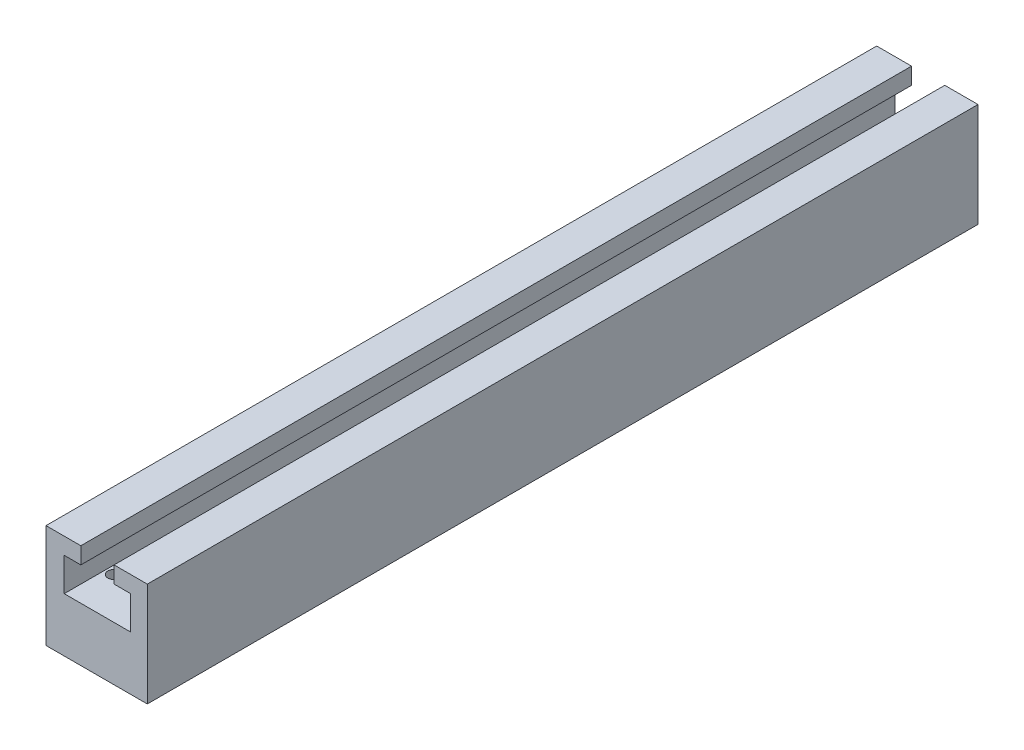
ISO-10303-21;
HEADER;
FILE_DESCRIPTION(('STEP AP214'),'2;1');
FILE_NAME('part.step','',(''),(''),'','','');
FILE_SCHEMA(('AUTOMOTIVE_DESIGN { 1 0 10303 214 1 1 1 1 }'));
ENDSEC;
DATA;
#1=APPLICATION_CONTEXT('core data for automotive mechanical design processes');
#2=APPLICATION_PROTOCOL_DEFINITION('international standard','automotive_design',2000,#1);
#3=PRODUCT_CONTEXT('',#1,'mechanical');
#4=PRODUCT('Part','Part','',(#3));
#5=PRODUCT_RELATED_PRODUCT_CATEGORY('part','',(#4));
#6=PRODUCT_DEFINITION_FORMATION('','',#4);
#7=PRODUCT_DEFINITION_CONTEXT('part definition',#1,'design');
#8=PRODUCT_DEFINITION('design','',#6,#7);
#9=PRODUCT_DEFINITION_SHAPE('','',#8);
#10=(LENGTH_UNIT() NAMED_UNIT(*) SI_UNIT(.MILLI.,.METRE.));
#11=(NAMED_UNIT(*) PLANE_ANGLE_UNIT() SI_UNIT($,.RADIAN.));
#12=(NAMED_UNIT(*) SI_UNIT($,.STERADIAN.) SOLID_ANGLE_UNIT());
#13=UNCERTAINTY_MEASURE_WITH_UNIT(LENGTH_MEASURE(1.E-05),#10,'distance_accuracy_value','');
#14=(GEOMETRIC_REPRESENTATION_CONTEXT(3) GLOBAL_UNCERTAINTY_ASSIGNED_CONTEXT((#13)) GLOBAL_UNIT_ASSIGNED_CONTEXT((#10,
#11,#12)) REPRESENTATION_CONTEXT('',''));
#15=CARTESIAN_POINT('',(0.,0.,0.));
#16=DIRECTION('',(0.,0.,1.));
#17=DIRECTION('',(1.,0.,0.));
#18=AXIS2_PLACEMENT_3D('',#15,#16,#17);
#19=CARTESIAN_POINT('',(0.,0.,0.));
#20=DIRECTION('',(0.,0.,1.));
#21=DIRECTION('',(1.,0.,0.));
#22=AXIS2_PLACEMENT_3D('',#19,#20,#21);
#23=PLANE('',#22);
#24=DIRECTION('',(-1.,0.,0.));
#25=VECTOR('',#24,1.);
#26=CARTESIAN_POINT('',(8.,16.,0.));
#27=LINE('',#26,#25);
#28=CARTESIAN_POINT('',(8.,16.,0.));
#29=VERTEX_POINT('',#28);
#30=CARTESIAN_POINT('',(-0.39,16.,0.));
#31=VERTEX_POINT('',#30);
#32=EDGE_CURVE('E225',#29,#31,#27,.T.);
#33=ORIENTED_EDGE('',*,*,#32,.T.);
#34=DIRECTION('',(0.,1.,0.));
#35=VECTOR('',#34,1.);
#36=CARTESIAN_POINT('',(-0.39,-9.,0.));
#37=LINE('',#36,#35);
#38=CARTESIAN_POINT('',(-0.39,-9.,0.));
#39=VERTEX_POINT('',#38);
#40=EDGE_CURVE('E214',#39,#31,#37,.T.);
#41=ORIENTED_EDGE('',*,*,#40,.F.);
#42=DIRECTION('',(1.,0.,0.));
#43=VECTOR('',#42,1.);
#44=CARTESIAN_POINT('',(0.,-9.,0.));
#45=LINE('',#44,#43);
#46=CARTESIAN_POINT('',(24.,-9.,0.));
#47=VERTEX_POINT('',#46);
#48=EDGE_CURVE('E245',#39,#47,#45,.T.);
#49=ORIENTED_EDGE('',*,*,#48,.T.);
#50=DIRECTION('',(0.,1.,0.));
#51=VECTOR('',#50,1.);
#52=CARTESIAN_POINT('',(24.,0.,0.));
#53=LINE('',#52,#51);
#54=CARTESIAN_POINT('',(24.,16.,0.));
#55=VERTEX_POINT('',#54);
#56=EDGE_CURVE('E252',#47,#55,#53,.T.);
#57=ORIENTED_EDGE('',*,*,#56,.T.);
#58=DIRECTION('',(-1.,0.,0.));
#59=VECTOR('',#58,1.);
#60=CARTESIAN_POINT('',(24.,16.,0.));
#61=LINE('',#60,#59);
#62=CARTESIAN_POINT('',(16.,16.,0.));
#63=VERTEX_POINT('',#62);
#64=EDGE_CURVE('E261',#55,#63,#61,.T.);
#65=ORIENTED_EDGE('',*,*,#64,.T.);
#66=DIRECTION('',(0.,-1.,0.));
#67=VECTOR('',#66,1.);
#68=CARTESIAN_POINT('',(16.,16.,0.));
#69=LINE('',#68,#67);
#70=CARTESIAN_POINT('',(16.,12.,0.));
#71=VERTEX_POINT('',#70);
#72=EDGE_CURVE('E179',#63,#71,#69,.T.);
#73=ORIENTED_EDGE('',*,*,#72,.T.);
#74=DIRECTION('',(1.,0.,0.));
#75=VECTOR('',#74,1.);
#76=CARTESIAN_POINT('',(16.,12.,0.));
#77=LINE('',#76,#75);
#78=CARTESIAN_POINT('',(20.,12.,0.));
#79=VERTEX_POINT('',#78);
#80=EDGE_CURVE('E173',#71,#79,#77,.T.);
#81=ORIENTED_EDGE('',*,*,#80,.T.);
#82=DIRECTION('',(0.,-1.,0.));
#83=VECTOR('',#82,1.);
#84=CARTESIAN_POINT('',(20.,12.,0.));
#85=LINE('',#84,#83);
#86=CARTESIAN_POINT('',(20.,4.,0.));
#87=VERTEX_POINT('',#86);
#88=EDGE_CURVE('E159',#79,#87,#85,.T.);
#89=ORIENTED_EDGE('',*,*,#88,.T.);
#90=DIRECTION('',(-1.,0.,0.));
#91=VECTOR('',#90,1.);
#92=CARTESIAN_POINT('',(20.,4.,0.));
#93=LINE('',#92,#91);
#94=CARTESIAN_POINT('',(4.,4.,0.));
#95=VERTEX_POINT('',#94);
#96=EDGE_CURVE('E193',#87,#95,#93,.T.);
#97=ORIENTED_EDGE('',*,*,#96,.T.);
#98=DIRECTION('',(0.,1.,0.));
#99=VECTOR('',#98,1.);
#100=CARTESIAN_POINT('',(4.,4.,0.));
#101=LINE('',#100,#99);
#102=CARTESIAN_POINT('',(4.,12.,0.));
#103=VERTEX_POINT('',#102);
#104=EDGE_CURVE('E53',#95,#103,#101,.T.);
#105=ORIENTED_EDGE('',*,*,#104,.T.);
#106=DIRECTION('',(1.,0.,0.));
#107=VECTOR('',#106,1.);
#108=CARTESIAN_POINT('',(4.,12.,0.));
#109=LINE('',#108,#107);
#110=CARTESIAN_POINT('',(8.,12.,0.));
#111=VERTEX_POINT('',#110);
#112=EDGE_CURVE('E201',#103,#111,#109,.T.);
#113=ORIENTED_EDGE('',*,*,#112,.T.);
#114=DIRECTION('',(0.,1.,0.));
#115=VECTOR('',#114,1.);
#116=CARTESIAN_POINT('',(8.,12.,0.));
#117=LINE('',#116,#115);
#118=EDGE_CURVE('E230',#111,#29,#117,.T.);
#119=ORIENTED_EDGE('',*,*,#118,.T.);
#120=EDGE_LOOP('',(#33,#41,#49,#57,#65,#73,#81,#89,#97,#105,#113,#119));
#121=FACE_BOUND('',#120,.T.);
#122=ADVANCED_FACE('F49',(#121),#23,.T.);
#123=CARTESIAN_POINT('',(0.,0.,-200.));
#124=DIRECTION('',(0.,0.,1.));
#125=DIRECTION('',(1.,0.,0.));
#126=AXIS2_PLACEMENT_3D('',#123,#124,#125);
#127=PLANE('',#126);
#128=DIRECTION('',(1.,0.,0.));
#129=VECTOR('',#128,1.);
#130=CARTESIAN_POINT('',(0.,-9.,-200.));
#131=LINE('',#130,#129);
#132=CARTESIAN_POINT('',(-0.39,-9.,-200.));
#133=VERTEX_POINT('',#132);
#134=CARTESIAN_POINT('',(24.,-9.,-200.));
#135=VERTEX_POINT('',#134);
#136=EDGE_CURVE('E247',#133,#135,#131,.T.);
#137=ORIENTED_EDGE('',*,*,#136,.F.);
#138=DIRECTION('',(0.,-1.,0.));
#139=VECTOR('',#138,1.);
#140=CARTESIAN_POINT('',(-0.39,16.,-200.));
#141=LINE('',#140,#139);
#142=CARTESIAN_POINT('',(-0.39,16.,-200.));
#143=VERTEX_POINT('',#142);
#144=EDGE_CURVE('E343',#143,#133,#141,.T.);
#145=ORIENTED_EDGE('',*,*,#144,.F.);
#146=DIRECTION('',(-1.,0.,0.));
#147=VECTOR('',#146,1.);
#148=CARTESIAN_POINT('',(8.,16.,-200.));
#149=LINE('',#148,#147);
#150=CARTESIAN_POINT('',(8.,16.,-200.));
#151=VERTEX_POINT('',#150);
#152=EDGE_CURVE('E238',#151,#143,#149,.T.);
#153=ORIENTED_EDGE('',*,*,#152,.F.);
#154=DIRECTION('',(0.,1.,0.));
#155=VECTOR('',#154,1.);
#156=CARTESIAN_POINT('',(8.,12.,-200.));
#157=LINE('',#156,#155);
#158=CARTESIAN_POINT('',(8.,12.,-200.));
#159=VERTEX_POINT('',#158);
#160=EDGE_CURVE('E226',#159,#151,#157,.T.);
#161=ORIENTED_EDGE('',*,*,#160,.F.);
#162=DIRECTION('',(1.,0.,0.));
#163=VECTOR('',#162,1.);
#164=CARTESIAN_POINT('',(4.,12.,-200.));
#165=LINE('',#164,#163);
#166=CARTESIAN_POINT('',(4.,12.,-200.));
#167=VERTEX_POINT('',#166);
#168=EDGE_CURVE('E208',#167,#159,#165,.T.);
#169=ORIENTED_EDGE('',*,*,#168,.F.);
#170=DIRECTION('',(0.,1.,0.));
#171=VECTOR('',#170,1.);
#172=CARTESIAN_POINT('',(4.,4.,-200.));
#173=LINE('',#172,#171);
#174=CARTESIAN_POINT('',(4.,4.,-200.));
#175=VERTEX_POINT('',#174);
#176=EDGE_CURVE('E11',#175,#167,#173,.T.);
#177=ORIENTED_EDGE('',*,*,#176,.F.);
#178=DIRECTION('',(-1.,0.,0.));
#179=VECTOR('',#178,1.);
#180=CARTESIAN_POINT('',(20.,4.,-200.));
#181=LINE('',#180,#179);
#182=CARTESIAN_POINT('',(20.,4.,-200.));
#183=VERTEX_POINT('',#182);
#184=EDGE_CURVE('E194',#183,#175,#181,.T.);
#185=ORIENTED_EDGE('',*,*,#184,.F.);
#186=DIRECTION('',(0.,-1.,0.));
#187=VECTOR('',#186,1.);
#188=CARTESIAN_POINT('',(20.,12.,-200.));
#189=LINE('',#188,#187);
#190=CARTESIAN_POINT('',(20.,12.,-200.));
#191=VERTEX_POINT('',#190);
#192=EDGE_CURVE('E169',#191,#183,#189,.T.);
#193=ORIENTED_EDGE('',*,*,#192,.F.);
#194=DIRECTION('',(1.,0.,0.));
#195=VECTOR('',#194,1.);
#196=CARTESIAN_POINT('',(16.,12.,-200.));
#197=LINE('',#196,#195);
#198=CARTESIAN_POINT('',(16.,12.,-200.));
#199=VERTEX_POINT('',#198);
#200=EDGE_CURVE('E152',#199,#191,#197,.T.);
#201=ORIENTED_EDGE('',*,*,#200,.F.);
#202=DIRECTION('',(0.,-1.,0.));
#203=VECTOR('',#202,1.);
#204=CARTESIAN_POINT('',(16.,16.,-200.));
#205=LINE('',#204,#203);
#206=CARTESIAN_POINT('',(16.,16.,-200.));
#207=VERTEX_POINT('',#206);
#208=EDGE_CURVE('E183',#207,#199,#205,.T.);
#209=ORIENTED_EDGE('',*,*,#208,.F.);
#210=DIRECTION('',(-1.,0.,0.));
#211=VECTOR('',#210,1.);
#212=CARTESIAN_POINT('',(24.,16.,-200.));
#213=LINE('',#212,#211);
#214=CARTESIAN_POINT('',(24.,16.,-200.));
#215=VERTEX_POINT('',#214);
#216=EDGE_CURVE('E264',#215,#207,#213,.T.);
#217=ORIENTED_EDGE('',*,*,#216,.F.);
#218=DIRECTION('',(0.,1.,0.));
#219=VECTOR('',#218,1.);
#220=CARTESIAN_POINT('',(24.,0.,-200.));
#221=LINE('',#220,#219);
#222=EDGE_CURVE('E256',#135,#215,#221,.T.);
#223=ORIENTED_EDGE('',*,*,#222,.F.);
#224=EDGE_LOOP('',(#137,#145,#153,#161,#169,#177,#185,#193,#201,#209,#217,#223));
#225=FACE_BOUND('',#224,.T.);
#226=ADVANCED_FACE('F273',(#225),#127,.F.);
#227=CARTESIAN_POINT('',(0.,-9.,-200.));
#228=DIRECTION('',(0.,-1.,0.));
#229=DIRECTION('',(0.,0.,-1.));
#230=AXIS2_PLACEMENT_3D('',#227,#228,#229);
#231=PLANE('',#230);
#232=CARTESIAN_POINT('',(6.,-9.,-190.));
#233=DIRECTION('',(0.,1.,0.));
#234=DIRECTION('',(0.,0.,1.));
#235=AXIS2_PLACEMENT_3D('',#232,#233,#234);
#236=CIRCLE('',#235,1.5);
#237=CARTESIAN_POINT('',(6.,-9.,-188.5));
#238=VERTEX_POINT('',#237);
#239=EDGE_CURVE('E235',#238,#238,#236,.T.);
#240=ORIENTED_EDGE('',*,*,#239,.T.);
#241=EDGE_LOOP('',(#240));
#242=FACE_BOUND('',#241,.T.);
#243=CARTESIAN_POINT('',(6.,-9.,-130.));
#244=DIRECTION('',(0.,1.,0.));
#245=DIRECTION('',(0.,0.,1.));
#246=AXIS2_PLACEMENT_3D('',#243,#244,#245);
#247=CIRCLE('',#246,1.5);
#248=CARTESIAN_POINT('',(6.,-9.,-128.5));
#249=VERTEX_POINT('',#248);
#250=EDGE_CURVE('E233',#249,#249,#247,.T.);
#251=ORIENTED_EDGE('',*,*,#250,.T.);
#252=EDGE_LOOP('',(#251));
#253=FACE_BOUND('',#252,.T.);
#254=CARTESIAN_POINT('',(6.,-9.,-70.));
#255=DIRECTION('',(0.,1.,0.));
#256=DIRECTION('',(0.,0.,1.));
#257=AXIS2_PLACEMENT_3D('',#254,#255,#256);
#258=CIRCLE('',#257,1.5);
#259=CARTESIAN_POINT('',(6.,-9.,-68.5));
#260=VERTEX_POINT('',#259);
#261=EDGE_CURVE('E236',#260,#260,#258,.T.);
#262=ORIENTED_EDGE('',*,*,#261,.T.);
#263=EDGE_LOOP('',(#262));
#264=FACE_BOUND('',#263,.T.);
#265=CARTESIAN_POINT('',(6.,-9.,-10.));
#266=DIRECTION('',(0.,1.,0.));
#267=DIRECTION('',(0.,0.,1.));
#268=AXIS2_PLACEMENT_3D('',#265,#266,#267);
#269=CIRCLE('',#268,1.5);
#270=CARTESIAN_POINT('',(6.,-9.,-8.5));
#271=VERTEX_POINT('',#270);
#272=EDGE_CURVE('E241',#271,#271,#269,.T.);
#273=ORIENTED_EDGE('',*,*,#272,.T.);
#274=EDGE_LOOP('',(#273));
#275=FACE_BOUND('',#274,.T.);
#276=ORIENTED_EDGE('',*,*,#48,.F.);
#277=DIRECTION('',(0.,0.,1.));
#278=VECTOR('',#277,1.);
#279=CARTESIAN_POINT('',(-0.39,-9.,-200.));
#280=LINE('',#279,#278);
#281=EDGE_CURVE('E217',#133,#39,#280,.T.);
#282=ORIENTED_EDGE('',*,*,#281,.F.);
#283=ORIENTED_EDGE('',*,*,#136,.T.);
#284=DIRECTION('',(0.,0.,1.));
#285=VECTOR('',#284,1.);
#286=CARTESIAN_POINT('',(24.,-9.,-200.));
#287=LINE('',#286,#285);
#288=EDGE_CURVE('E249',#135,#47,#287,.T.);
#289=ORIENTED_EDGE('',*,*,#288,.T.);
#290=EDGE_LOOP('',(#276,#282,#283,#289));
#291=FACE_BOUND('',#290,.T.);
#292=ADVANCED_FACE('F293',(#242,#253,#264,#275,#291),#231,.T.);
#293=CARTESIAN_POINT('',(8.,16.,-200.));
#294=DIRECTION('',(0.,1.,0.));
#295=DIRECTION('',(1.,0.,0.));
#296=AXIS2_PLACEMENT_3D('',#293,#294,#295);
#297=PLANE('',#296);
#298=ORIENTED_EDGE('',*,*,#152,.T.);
#299=DIRECTION('',(0.,0.,-1.));
#300=VECTOR('',#299,1.);
#301=CARTESIAN_POINT('',(-0.39,16.,0.));
#302=LINE('',#301,#300);
#303=EDGE_CURVE('E345',#31,#143,#302,.T.);
#304=ORIENTED_EDGE('',*,*,#303,.F.);
#305=ORIENTED_EDGE('',*,*,#32,.F.);
#306=DIRECTION('',(0.,0.,1.));
#307=VECTOR('',#306,1.);
#308=CARTESIAN_POINT('',(8.,16.,-200.));
#309=LINE('',#308,#307);
#310=EDGE_CURVE('E222',#151,#29,#309,.T.);
#311=ORIENTED_EDGE('',*,*,#310,.F.);
#312=EDGE_LOOP('',(#298,#304,#305,#311));
#313=FACE_BOUND('',#312,.T.);
#314=ADVANCED_FACE('F284',(#313),#297,.T.);
#315=CARTESIAN_POINT('',(6.,7.8295433934414,-10.));
#316=DIRECTION('',(0.,-1.,0.));
#317=DIRECTION('',(0.,0.,-1.));
#318=AXIS2_PLACEMENT_3D('',#315,#316,#317);
#319=CYLINDRICAL_SURFACE('',#318,1.5);
#320=ORIENTED_EDGE('',*,*,#272,.F.);
#321=EDGE_LOOP('',(#320));
#322=FACE_BOUND('',#321,.T.);
#323=CARTESIAN_POINT('',(6.,4.,-10.));
#324=DIRECTION('',(0.,-1.,0.));
#325=DIRECTION('',(-1.,0.,0.));
#326=AXIS2_PLACEMENT_3D('',#323,#324,#325);
#327=CIRCLE('',#326,1.5);
#328=CARTESIAN_POINT('',(4.5,4.,-10.));
#329=VERTEX_POINT('',#328);
#330=EDGE_CURVE('E187',#329,#329,#327,.T.);
#331=ORIENTED_EDGE('',*,*,#330,.F.);
#332=EDGE_LOOP('',(#331));
#333=FACE_BOUND('',#332,.T.);
#334=ADVANCED_FACE('F51',(#322,#333),#319,.F.);
#335=CARTESIAN_POINT('',(6.,7.8295433934414,-70.));
#336=DIRECTION('',(0.,-1.,0.));
#337=DIRECTION('',(0.,0.,-1.));
#338=AXIS2_PLACEMENT_3D('',#335,#336,#337);
#339=CYLINDRICAL_SURFACE('',#338,1.5);
#340=ORIENTED_EDGE('',*,*,#261,.F.);
#341=EDGE_LOOP('',(#340));
#342=FACE_BOUND('',#341,.T.);
#343=CARTESIAN_POINT('',(6.,4.,-70.));
#344=DIRECTION('',(0.,-1.,0.));
#345=DIRECTION('',(-1.,0.,0.));
#346=AXIS2_PLACEMENT_3D('',#343,#344,#345);
#347=CIRCLE('',#346,1.5);
#348=CARTESIAN_POINT('',(4.5,4.,-70.));
#349=VERTEX_POINT('',#348);
#350=EDGE_CURVE('E93',#349,#349,#347,.T.);
#351=ORIENTED_EDGE('',*,*,#350,.F.);
#352=EDGE_LOOP('',(#351));
#353=FACE_BOUND('',#352,.T.);
#354=ADVANCED_FACE('F283',(#342,#353),#339,.F.);
#355=CARTESIAN_POINT('',(6.,7.8295433934414,-130.));
#356=DIRECTION('',(0.,-1.,0.));
#357=DIRECTION('',(0.,0.,-1.));
#358=AXIS2_PLACEMENT_3D('',#355,#356,#357);
#359=CYLINDRICAL_SURFACE('',#358,1.5);
#360=ORIENTED_EDGE('',*,*,#250,.F.);
#361=EDGE_LOOP('',(#360));
#362=FACE_BOUND('',#361,.T.);
#363=CARTESIAN_POINT('',(6.,4.,-130.));
#364=DIRECTION('',(0.,-1.,0.));
#365=DIRECTION('',(-1.,0.,0.));
#366=AXIS2_PLACEMENT_3D('',#363,#364,#365);
#367=CIRCLE('',#366,1.5);
#368=CARTESIAN_POINT('',(4.5,4.,-130.));
#369=VERTEX_POINT('',#368);
#370=EDGE_CURVE('E98',#369,#369,#367,.T.);
#371=ORIENTED_EDGE('',*,*,#370,.F.);
#372=EDGE_LOOP('',(#371));
#373=FACE_BOUND('',#372,.T.);
#374=ADVANCED_FACE('F290',(#362,#373),#359,.F.);
#375=CARTESIAN_POINT('',(6.,7.8295433934414,-190.));
#376=DIRECTION('',(0.,-1.,0.));
#377=DIRECTION('',(0.,0.,-1.));
#378=AXIS2_PLACEMENT_3D('',#375,#376,#377);
#379=CYLINDRICAL_SURFACE('',#378,1.5);
#380=ORIENTED_EDGE('',*,*,#239,.F.);
#381=EDGE_LOOP('',(#380));
#382=FACE_BOUND('',#381,.T.);
#383=CARTESIAN_POINT('',(6.,4.,-190.));
#384=DIRECTION('',(0.,-1.,0.));
#385=DIRECTION('',(-1.,0.,0.));
#386=AXIS2_PLACEMENT_3D('',#383,#384,#385);
#387=CIRCLE('',#386,1.5);
#388=CARTESIAN_POINT('',(4.5,4.,-190.));
#389=VERTEX_POINT('',#388);
#390=EDGE_CURVE('E191',#389,#389,#387,.T.);
#391=ORIENTED_EDGE('',*,*,#390,.F.);
#392=EDGE_LOOP('',(#391));
#393=FACE_BOUND('',#392,.T.);
#394=ADVANCED_FACE('F308',(#382,#393),#379,.F.);
#395=CARTESIAN_POINT('',(4.,4.,-200.));
#396=DIRECTION('',(1.,0.,0.));
#397=DIRECTION('',(0.,-1.,0.));
#398=AXIS2_PLACEMENT_3D('',#395,#396,#397);
#399=PLANE('',#398);
#400=ORIENTED_EDGE('',*,*,#104,.F.);
#401=DIRECTION('',(0.,0.,1.));
#402=VECTOR('',#401,1.);
#403=CARTESIAN_POINT('',(4.,4.,-200.));
#404=LINE('',#403,#402);
#405=EDGE_CURVE('E196',#175,#95,#404,.T.);
#406=ORIENTED_EDGE('',*,*,#405,.F.);
#407=ORIENTED_EDGE('',*,*,#176,.T.);
#408=DIRECTION('',(0.,0.,1.));
#409=VECTOR('',#408,1.);
#410=CARTESIAN_POINT('',(4.,12.,-200.));
#411=LINE('',#410,#409);
#412=EDGE_CURVE('E204',#167,#103,#411,.T.);
#413=ORIENTED_EDGE('',*,*,#412,.T.);
#414=EDGE_LOOP('',(#400,#406,#407,#413));
#415=FACE_BOUND('',#414,.T.);
#416=ADVANCED_FACE('F205',(#415),#399,.T.);
#417=CARTESIAN_POINT('',(20.,4.,-200.));
#418=DIRECTION('',(0.,1.,0.));
#419=DIRECTION('',(1.,0.,0.));
#420=AXIS2_PLACEMENT_3D('',#417,#418,#419);
#421=PLANE('',#420);
#422=ORIENTED_EDGE('',*,*,#96,.F.);
#423=DIRECTION('',(0.,0.,1.));
#424=VECTOR('',#423,1.);
#425=CARTESIAN_POINT('',(20.,4.,-200.));
#426=LINE('',#425,#424);
#427=EDGE_CURVE('E165',#183,#87,#426,.T.);
#428=ORIENTED_EDGE('',*,*,#427,.F.);
#429=ORIENTED_EDGE('',*,*,#184,.T.);
#430=ORIENTED_EDGE('',*,*,#405,.T.);
#431=EDGE_LOOP('',(#422,#428,#429,#430));
#432=FACE_BOUND('',#431,.T.);
#433=ORIENTED_EDGE('',*,*,#390,.T.);
#434=EDGE_LOOP('',(#433));
#435=FACE_BOUND('',#434,.T.);
#436=ORIENTED_EDGE('',*,*,#370,.T.);
#437=EDGE_LOOP('',(#436));
#438=FACE_BOUND('',#437,.T.);
#439=ORIENTED_EDGE('',*,*,#350,.T.);
#440=EDGE_LOOP('',(#439));
#441=FACE_BOUND('',#440,.T.);
#442=ORIENTED_EDGE('',*,*,#330,.T.);
#443=EDGE_LOOP('',(#442));
#444=FACE_BOUND('',#443,.T.);
#445=ADVANCED_FACE('F274',(#432,#435,#438,#441,#444),#421,.T.);
#446=CARTESIAN_POINT('',(20.,12.,-200.));
#447=DIRECTION('',(-1.,0.,0.));
#448=DIRECTION('',(0.,1.,0.));
#449=AXIS2_PLACEMENT_3D('',#446,#447,#448);
#450=PLANE('',#449);
#451=ORIENTED_EDGE('',*,*,#88,.F.);
#452=DIRECTION('',(0.,0.,1.));
#453=VECTOR('',#452,1.);
#454=CARTESIAN_POINT('',(20.,12.,-200.));
#455=LINE('',#454,#453);
#456=EDGE_CURVE('E163',#191,#79,#455,.T.);
#457=ORIENTED_EDGE('',*,*,#456,.F.);
#458=ORIENTED_EDGE('',*,*,#192,.T.);
#459=ORIENTED_EDGE('',*,*,#427,.T.);
#460=EDGE_LOOP('',(#451,#457,#458,#459));
#461=FACE_BOUND('',#460,.T.);
#462=ADVANCED_FACE('F161',(#461),#450,.T.);
#463=CARTESIAN_POINT('',(16.,12.,-200.));
#464=DIRECTION('',(0.,-1.,0.));
#465=DIRECTION('',(-1.,0.,0.));
#466=AXIS2_PLACEMENT_3D('',#463,#464,#465);
#467=PLANE('',#466);
#468=ORIENTED_EDGE('',*,*,#80,.F.);
#469=DIRECTION('',(0.,0.,1.));
#470=VECTOR('',#469,1.);
#471=CARTESIAN_POINT('',(16.,12.,-200.));
#472=LINE('',#471,#470);
#473=EDGE_CURVE('E180',#199,#71,#472,.T.);
#474=ORIENTED_EDGE('',*,*,#473,.F.);
#475=ORIENTED_EDGE('',*,*,#200,.T.);
#476=ORIENTED_EDGE('',*,*,#456,.T.);
#477=EDGE_LOOP('',(#468,#474,#475,#476));
#478=FACE_BOUND('',#477,.T.);
#479=ADVANCED_FACE('F172',(#478),#467,.T.);
#480=CARTESIAN_POINT('',(16.,16.,-200.));
#481=DIRECTION('',(-1.,0.,0.));
#482=DIRECTION('',(0.,0.,1.));
#483=AXIS2_PLACEMENT_3D('',#480,#481,#482);
#484=PLANE('',#483);
#485=ORIENTED_EDGE('',*,*,#72,.F.);
#486=DIRECTION('',(0.,0.,1.));
#487=VECTOR('',#486,1.);
#488=CARTESIAN_POINT('',(16.,16.,-200.));
#489=LINE('',#488,#487);
#490=EDGE_CURVE('E267',#207,#63,#489,.T.);
#491=ORIENTED_EDGE('',*,*,#490,.F.);
#492=ORIENTED_EDGE('',*,*,#208,.T.);
#493=ORIENTED_EDGE('',*,*,#473,.T.);
#494=EDGE_LOOP('',(#485,#491,#492,#493));
#495=FACE_BOUND('',#494,.T.);
#496=ADVANCED_FACE('F359',(#495),#484,.T.);
#497=CARTESIAN_POINT('',(24.,16.,-200.));
#498=DIRECTION('',(0.,1.,0.));
#499=DIRECTION('',(1.,0.,0.));
#500=AXIS2_PLACEMENT_3D('',#497,#498,#499);
#501=PLANE('',#500);
#502=ORIENTED_EDGE('',*,*,#64,.F.);
#503=DIRECTION('',(0.,0.,1.));
#504=VECTOR('',#503,1.);
#505=CARTESIAN_POINT('',(24.,16.,-200.));
#506=LINE('',#505,#504);
#507=EDGE_CURVE('E259',#215,#55,#506,.T.);
#508=ORIENTED_EDGE('',*,*,#507,.F.);
#509=ORIENTED_EDGE('',*,*,#216,.T.);
#510=ORIENTED_EDGE('',*,*,#490,.T.);
#511=EDGE_LOOP('',(#502,#508,#509,#510));
#512=FACE_BOUND('',#511,.T.);
#513=ADVANCED_FACE('F356',(#512),#501,.T.);
#514=CARTESIAN_POINT('',(24.,0.,-200.));
#515=DIRECTION('',(1.,0.,0.));
#516=DIRECTION('',(0.,1.,0.));
#517=AXIS2_PLACEMENT_3D('',#514,#515,#516);
#518=PLANE('',#517);
#519=ORIENTED_EDGE('',*,*,#56,.F.);
#520=ORIENTED_EDGE('',*,*,#288,.F.);
#521=ORIENTED_EDGE('',*,*,#222,.T.);
#522=ORIENTED_EDGE('',*,*,#507,.T.);
#523=EDGE_LOOP('',(#519,#520,#521,#522));
#524=FACE_BOUND('',#523,.T.);
#525=ADVANCED_FACE('F354',(#524),#518,.T.);
#526=CARTESIAN_POINT('',(8.,12.,-200.));
#527=DIRECTION('',(1.,0.,0.));
#528=DIRECTION('',(0.,1.,0.));
#529=AXIS2_PLACEMENT_3D('',#526,#527,#528);
#530=PLANE('',#529);
#531=ORIENTED_EDGE('',*,*,#118,.F.);
#532=DIRECTION('',(0.,0.,1.));
#533=VECTOR('',#532,1.);
#534=CARTESIAN_POINT('',(8.,12.,-200.));
#535=LINE('',#534,#533);
#536=EDGE_CURVE('E213',#159,#111,#535,.T.);
#537=ORIENTED_EDGE('',*,*,#536,.F.);
#538=ORIENTED_EDGE('',*,*,#160,.T.);
#539=ORIENTED_EDGE('',*,*,#310,.T.);
#540=EDGE_LOOP('',(#531,#537,#538,#539));
#541=FACE_BOUND('',#540,.T.);
#542=ADVANCED_FACE('F347',(#541),#530,.T.);
#543=CARTESIAN_POINT('',(4.,12.,-200.));
#544=DIRECTION('',(0.,-1.,0.));
#545=DIRECTION('',(0.,0.,-1.));
#546=AXIS2_PLACEMENT_3D('',#543,#544,#545);
#547=PLANE('',#546);
#548=ORIENTED_EDGE('',*,*,#112,.F.);
#549=ORIENTED_EDGE('',*,*,#412,.F.);
#550=ORIENTED_EDGE('',*,*,#168,.T.);
#551=ORIENTED_EDGE('',*,*,#536,.T.);
#552=EDGE_LOOP('',(#548,#549,#550,#551));
#553=FACE_BOUND('',#552,.T.);
#554=ADVANCED_FACE('F211',(#553),#547,.T.);
#555=CARTESIAN_POINT('',(-0.39,0.,0.));
#556=DIRECTION('',(-1.,0.,0.));
#557=DIRECTION('',(0.,0.,1.));
#558=AXIS2_PLACEMENT_3D('',#555,#556,#557);
#559=PLANE('',#558);
#560=ORIENTED_EDGE('',*,*,#303,.T.);
#561=ORIENTED_EDGE('',*,*,#144,.T.);
#562=ORIENTED_EDGE('',*,*,#281,.T.);
#563=ORIENTED_EDGE('',*,*,#40,.T.);
#564=EDGE_LOOP('',(#560,#561,#562,#563));
#565=FACE_BOUND('',#564,.T.);
#566=ADVANCED_FACE('F340',(#565),#559,.T.);
#567=CLOSED_SHELL('',(#122,#226,#292,#314,#334,#354,#374,#394,#416,#445,#462,#479,#496,#513,
#525,#542,#554,#566));
#568=MANIFOLD_SOLID_BREP('B2',#567);
#569=ADVANCED_BREP_SHAPE_REPRESENTATION('',(#18,#568),#14);
#570=SHAPE_DEFINITION_REPRESENTATION(#9,#569);
ENDSEC;
END-ISO-10303-21;
